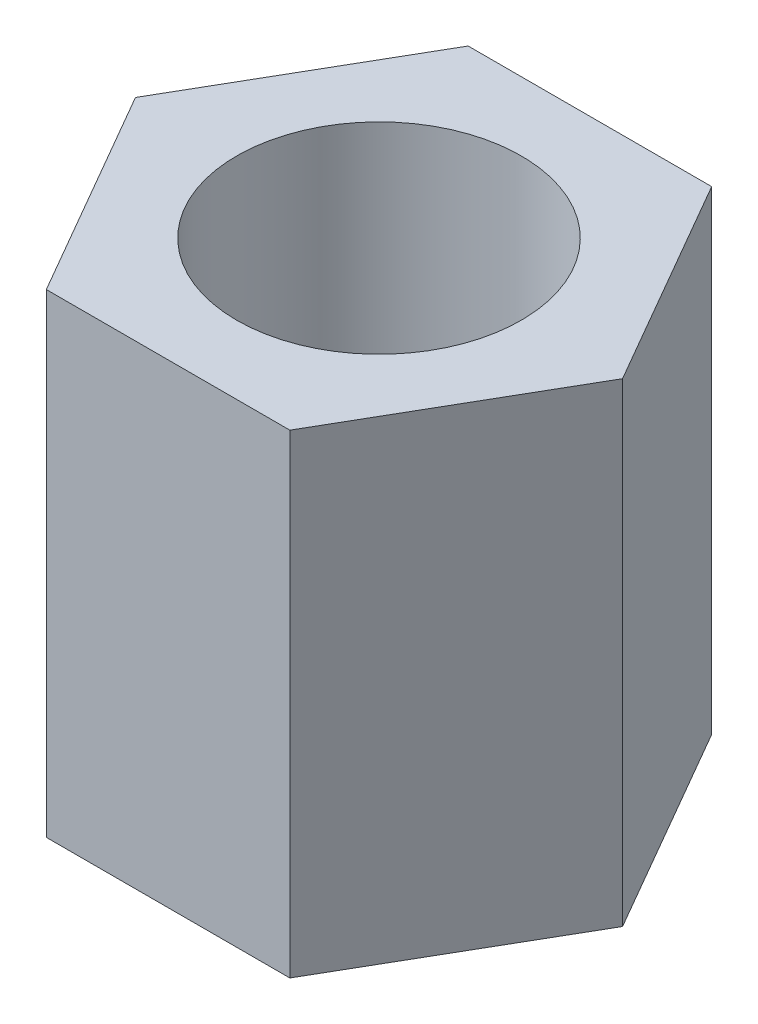
ISO-10303-21;
HEADER;
FILE_DESCRIPTION(('STEP AP214'),'2;1');
FILE_NAME('part.step','',(''),(''),'','','');
FILE_SCHEMA(('AUTOMOTIVE_DESIGN { 1 0 10303 214 1 1 1 1 }'));
ENDSEC;
DATA;
#1=APPLICATION_CONTEXT('core data for automotive mechanical design processes');
#2=APPLICATION_PROTOCOL_DEFINITION('international standard','automotive_design',2000,#1);
#3=PRODUCT_CONTEXT('',#1,'mechanical');
#4=PRODUCT('Part','Part','',(#3));
#5=PRODUCT_RELATED_PRODUCT_CATEGORY('part','',(#4));
#6=PRODUCT_DEFINITION_FORMATION('','',#4);
#7=PRODUCT_DEFINITION_CONTEXT('part definition',#1,'design');
#8=PRODUCT_DEFINITION('design','',#6,#7);
#9=PRODUCT_DEFINITION_SHAPE('','',#8);
#10=(LENGTH_UNIT() NAMED_UNIT(*) SI_UNIT(.MILLI.,.METRE.));
#11=(NAMED_UNIT(*) PLANE_ANGLE_UNIT() SI_UNIT($,.RADIAN.));
#12=(NAMED_UNIT(*) SI_UNIT($,.STERADIAN.) SOLID_ANGLE_UNIT());
#13=UNCERTAINTY_MEASURE_WITH_UNIT(LENGTH_MEASURE(1.E-05),#10,'distance_accuracy_value','');
#14=(GEOMETRIC_REPRESENTATION_CONTEXT(3) GLOBAL_UNCERTAINTY_ASSIGNED_CONTEXT((#13)) GLOBAL_UNIT_ASSIGNED_CONTEXT((#10,
#11,#12)) REPRESENTATION_CONTEXT('',''));
#15=CARTESIAN_POINT('',(0.,0.,0.));
#16=DIRECTION('',(0.,0.,1.));
#17=DIRECTION('',(1.,0.,0.));
#18=AXIS2_PLACEMENT_3D('',#15,#16,#17);
#19=CARTESIAN_POINT('',(0.,5.,0.));
#20=DIRECTION('',(0.,1.,0.));
#21=DIRECTION('',(0.,0.,1.));
#22=AXIS2_PLACEMENT_3D('',#19,#20,#21);
#23=PLANE('',#22);
#24=DIRECTION('',(0.499999999999995,0.,-0.866025403784442));
#25=VECTOR('',#24,1.);
#26=CARTESIAN_POINT('',(1.28323950277336,5.,2.22263601708282));
#27=LINE('',#26,#25);
#28=CARTESIAN_POINT('',(1.28323950277336,5.,2.22263601708282));
#29=VERTEX_POINT('',#28);
#30=CARTESIAN_POINT('',(2.56647900554667,5.,0.));
#31=VERTEX_POINT('',#30);
#32=EDGE_CURVE('E146',#29,#31,#27,.T.);
#33=ORIENTED_EDGE('',*,*,#32,.T.);
#34=DIRECTION('',(-0.500000000000001,0.,-0.866025403784438));
#35=VECTOR('',#34,1.);
#36=CARTESIAN_POINT('',(2.56647900554667,5.,0.));
#37=LINE('',#36,#35);
#38=CARTESIAN_POINT('',(1.28323950277333,5.,-2.22263601708284));
#39=VERTEX_POINT('',#38);
#40=EDGE_CURVE('E94',#31,#39,#37,.T.);
#41=ORIENTED_EDGE('',*,*,#40,.T.);
#42=DIRECTION('',(-1.,0.,0.));
#43=VECTOR('',#42,1.);
#44=CARTESIAN_POINT('',(1.28323950277333,5.,-2.22263601708284));
#45=LINE('',#44,#43);
#46=CARTESIAN_POINT('',(-1.28323950277334,5.,-2.22263601708283));
#47=VERTEX_POINT('',#46);
#48=EDGE_CURVE('E107',#39,#47,#45,.T.);
#49=ORIENTED_EDGE('',*,*,#48,.T.);
#50=DIRECTION('',(-0.499999999999995,0.,0.866025403784442));
#51=VECTOR('',#50,1.);
#52=CARTESIAN_POINT('',(-1.28323950277334,5.,-2.22263601708283));
#53=LINE('',#52,#51);
#54=CARTESIAN_POINT('',(-2.56647900554667,5.,0.));
#55=VERTEX_POINT('',#54);
#56=EDGE_CURVE('E101',#47,#55,#53,.T.);
#57=ORIENTED_EDGE('',*,*,#56,.T.);
#58=DIRECTION('',(0.500000000000007,0.,0.866025403784435));
#59=VECTOR('',#58,1.);
#60=CARTESIAN_POINT('',(-2.56647900554667,5.,0.));
#61=LINE('',#60,#59);
#62=CARTESIAN_POINT('',(-1.28323950277331,5.,2.22263601708285));
#63=VERTEX_POINT('',#62);
#64=EDGE_CURVE('E105',#55,#63,#61,.T.);
#65=ORIENTED_EDGE('',*,*,#64,.T.);
#66=DIRECTION('',(1.,0.,0.));
#67=VECTOR('',#66,1.);
#68=CARTESIAN_POINT('',(-1.28323950277331,5.,2.22263601708285));
#69=LINE('',#68,#67);
#70=EDGE_CURVE('E57',#63,#29,#69,.T.);
#71=ORIENTED_EDGE('',*,*,#70,.T.);
#72=EDGE_LOOP('',(#33,#41,#49,#57,#65,#71));
#73=FACE_BOUND('',#72,.T.);
#74=CARTESIAN_POINT('',(0.,5.,0.));
#75=DIRECTION('',(0.,1.,0.));
#76=DIRECTION('',(0.,0.,1.));
#77=AXIS2_PLACEMENT_3D('',#74,#75,#76);
#78=CIRCLE('',#77,1.5);
#79=CARTESIAN_POINT('',(0.,5.,1.5));
#80=VERTEX_POINT('',#79);
#81=EDGE_CURVE('E134',#80,#80,#78,.T.);
#82=ORIENTED_EDGE('',*,*,#81,.F.);
#83=EDGE_LOOP('',(#82));
#84=FACE_BOUND('',#83,.T.);
#85=ADVANCED_FACE('F39',(#73,#84),#23,.T.);
#86=CARTESIAN_POINT('',(0.,0.,0.));
#87=DIRECTION('',(0.,1.,0.));
#88=DIRECTION('',(0.,0.,1.));
#89=AXIS2_PLACEMENT_3D('',#86,#87,#88);
#90=PLANE('',#89);
#91=DIRECTION('',(0.499999999999995,0.,-0.866025403784442));
#92=VECTOR('',#91,1.);
#93=CARTESIAN_POINT('',(1.28323950277336,0.,2.22263601708282));
#94=LINE('',#93,#92);
#95=CARTESIAN_POINT('',(1.28323950277336,0.,2.22263601708282));
#96=VERTEX_POINT('',#95);
#97=CARTESIAN_POINT('',(2.56647900554667,0.,0.));
#98=VERTEX_POINT('',#97);
#99=EDGE_CURVE('E129',#96,#98,#94,.T.);
#100=ORIENTED_EDGE('',*,*,#99,.F.);
#101=DIRECTION('',(1.,0.,0.));
#102=VECTOR('',#101,1.);
#103=CARTESIAN_POINT('',(-1.28323950277331,0.,2.22263601708285));
#104=LINE('',#103,#102);
#105=CARTESIAN_POINT('',(-1.28323950277331,0.,2.22263601708285));
#106=VERTEX_POINT('',#105);
#107=EDGE_CURVE('E86',#106,#96,#104,.T.);
#108=ORIENTED_EDGE('',*,*,#107,.F.);
#109=DIRECTION('',(0.500000000000007,0.,0.866025403784435));
#110=VECTOR('',#109,1.);
#111=CARTESIAN_POINT('',(-2.56647900554667,0.,0.));
#112=LINE('',#111,#110);
#113=CARTESIAN_POINT('',(-2.56647900554667,0.,0.));
#114=VERTEX_POINT('',#113);
#115=EDGE_CURVE('E80',#114,#106,#112,.T.);
#116=ORIENTED_EDGE('',*,*,#115,.F.);
#117=DIRECTION('',(-0.499999999999995,0.,0.866025403784442));
#118=VECTOR('',#117,1.);
#119=CARTESIAN_POINT('',(-1.28323950277334,0.,-2.22263601708283));
#120=LINE('',#119,#118);
#121=CARTESIAN_POINT('',(-1.28323950277334,0.,-2.22263601708283));
#122=VERTEX_POINT('',#121);
#123=EDGE_CURVE('E116',#122,#114,#120,.T.);
#124=ORIENTED_EDGE('',*,*,#123,.F.);
#125=DIRECTION('',(-1.,0.,0.));
#126=VECTOR('',#125,1.);
#127=CARTESIAN_POINT('',(1.28323950277333,0.,-2.22263601708284));
#128=LINE('',#127,#126);
#129=CARTESIAN_POINT('',(1.28323950277333,0.,-2.22263601708284));
#130=VERTEX_POINT('',#129);
#131=EDGE_CURVE('E137',#130,#122,#128,.T.);
#132=ORIENTED_EDGE('',*,*,#131,.F.);
#133=DIRECTION('',(-0.500000000000001,0.,-0.866025403784438));
#134=VECTOR('',#133,1.);
#135=CARTESIAN_POINT('',(2.56647900554667,0.,0.));
#136=LINE('',#135,#134);
#137=EDGE_CURVE('E133',#98,#130,#136,.T.);
#138=ORIENTED_EDGE('',*,*,#137,.F.);
#139=EDGE_LOOP('',(#100,#108,#116,#124,#132,#138));
#140=FACE_BOUND('',#139,.T.);
#141=CARTESIAN_POINT('',(0.,0.,0.));
#142=DIRECTION('',(0.,1.,0.));
#143=DIRECTION('',(0.,0.,1.));
#144=AXIS2_PLACEMENT_3D('',#141,#142,#143);
#145=CIRCLE('',#144,1.5);
#146=CARTESIAN_POINT('',(0.,0.,1.5));
#147=VERTEX_POINT('',#146);
#148=EDGE_CURVE('E243',#147,#147,#145,.T.);
#149=ORIENTED_EDGE('',*,*,#148,.T.);
#150=EDGE_LOOP('',(#149));
#151=FACE_BOUND('',#150,.T.);
#152=ADVANCED_FACE('F159',(#140,#151),#90,.F.);
#153=CARTESIAN_POINT('',(1.28323950277336,5.,2.22263601708282));
#154=DIRECTION('',(-0.866025403784442,0.,-0.499999999999995));
#155=DIRECTION('',(-0.499999999999995,0.,0.866025403784442));
#156=AXIS2_PLACEMENT_3D('',#153,#154,#155);
#157=PLANE('',#156);
#158=ORIENTED_EDGE('',*,*,#99,.T.);
#159=DIRECTION('',(0.,-1.,0.));
#160=VECTOR('',#159,1.);
#161=CARTESIAN_POINT('',(2.56647900554667,5.,0.));
#162=LINE('',#161,#160);
#163=EDGE_CURVE('E11',#31,#98,#162,.T.);
#164=ORIENTED_EDGE('',*,*,#163,.F.);
#165=ORIENTED_EDGE('',*,*,#32,.F.);
#166=DIRECTION('',(0.,-1.,0.));
#167=VECTOR('',#166,1.);
#168=CARTESIAN_POINT('',(1.28323950277336,5.,2.22263601708282));
#169=LINE('',#168,#167);
#170=EDGE_CURVE('E125',#29,#96,#169,.T.);
#171=ORIENTED_EDGE('',*,*,#170,.T.);
#172=EDGE_LOOP('',(#158,#164,#165,#171));
#173=FACE_BOUND('',#172,.T.);
#174=ADVANCED_FACE('F41',(#173),#157,.F.);
#175=CARTESIAN_POINT('',(2.56647900554667,5.,0.));
#176=DIRECTION('',(-0.866025403784438,0.,0.500000000000001));
#177=DIRECTION('',(0.500000000000001,0.,0.866025403784438));
#178=AXIS2_PLACEMENT_3D('',#175,#176,#177);
#179=PLANE('',#178);
#180=ORIENTED_EDGE('',*,*,#137,.T.);
#181=DIRECTION('',(0.,-1.,0.));
#182=VECTOR('',#181,1.);
#183=CARTESIAN_POINT('',(1.28323950277333,5.,-2.22263601708284));
#184=LINE('',#183,#182);
#185=EDGE_CURVE('E49',#39,#130,#184,.T.);
#186=ORIENTED_EDGE('',*,*,#185,.F.);
#187=ORIENTED_EDGE('',*,*,#40,.F.);
#188=ORIENTED_EDGE('',*,*,#163,.T.);
#189=EDGE_LOOP('',(#180,#186,#187,#188));
#190=FACE_BOUND('',#189,.T.);
#191=ADVANCED_FACE('F184',(#190),#179,.F.);
#192=CARTESIAN_POINT('',(1.28323950277333,5.,-2.22263601708284));
#193=DIRECTION('',(0.,0.,1.));
#194=DIRECTION('',(1.,0.,0.));
#195=AXIS2_PLACEMENT_3D('',#192,#193,#194);
#196=PLANE('',#195);
#197=ORIENTED_EDGE('',*,*,#131,.T.);
#198=DIRECTION('',(0.,-1.,0.));
#199=VECTOR('',#198,1.);
#200=CARTESIAN_POINT('',(-1.28323950277334,5.,-2.22263601708283));
#201=LINE('',#200,#199);
#202=EDGE_CURVE('E118',#47,#122,#201,.T.);
#203=ORIENTED_EDGE('',*,*,#202,.F.);
#204=ORIENTED_EDGE('',*,*,#48,.F.);
#205=ORIENTED_EDGE('',*,*,#185,.T.);
#206=EDGE_LOOP('',(#197,#203,#204,#205));
#207=FACE_BOUND('',#206,.T.);
#208=ADVANCED_FACE('F156',(#207),#196,.F.);
#209=CARTESIAN_POINT('',(-1.28323950277334,5.,-2.22263601708283));
#210=DIRECTION('',(0.866025403784442,0.,0.499999999999995));
#211=DIRECTION('',(0.499999999999995,0.,-0.866025403784442));
#212=AXIS2_PLACEMENT_3D('',#209,#210,#211);
#213=PLANE('',#212);
#214=ORIENTED_EDGE('',*,*,#123,.T.);
#215=DIRECTION('',(0.,-1.,0.));
#216=VECTOR('',#215,1.);
#217=CARTESIAN_POINT('',(-2.56647900554667,5.,0.));
#218=LINE('',#217,#216);
#219=EDGE_CURVE('E113',#55,#114,#218,.T.);
#220=ORIENTED_EDGE('',*,*,#219,.F.);
#221=ORIENTED_EDGE('',*,*,#56,.F.);
#222=ORIENTED_EDGE('',*,*,#202,.T.);
#223=EDGE_LOOP('',(#214,#220,#221,#222));
#224=FACE_BOUND('',#223,.T.);
#225=ADVANCED_FACE('F114',(#224),#213,.F.);
#226=CARTESIAN_POINT('',(-2.56647900554667,5.,0.));
#227=DIRECTION('',(0.866025403784435,0.,-0.500000000000007));
#228=DIRECTION('',(-0.500000000000007,0.,-0.866025403784435));
#229=AXIS2_PLACEMENT_3D('',#226,#227,#228);
#230=PLANE('',#229);
#231=ORIENTED_EDGE('',*,*,#115,.T.);
#232=DIRECTION('',(0.,-1.,0.));
#233=VECTOR('',#232,1.);
#234=CARTESIAN_POINT('',(-1.28323950277331,5.,2.22263601708285));
#235=LINE('',#234,#233);
#236=EDGE_CURVE('E119',#63,#106,#235,.T.);
#237=ORIENTED_EDGE('',*,*,#236,.F.);
#238=ORIENTED_EDGE('',*,*,#64,.F.);
#239=ORIENTED_EDGE('',*,*,#219,.T.);
#240=EDGE_LOOP('',(#231,#237,#238,#239));
#241=FACE_BOUND('',#240,.T.);
#242=ADVANCED_FACE('F121',(#241),#230,.F.);
#243=CARTESIAN_POINT('',(-1.28323950277331,5.,2.22263601708285));
#244=DIRECTION('',(0.,0.,-1.));
#245=DIRECTION('',(-1.,0.,0.));
#246=AXIS2_PLACEMENT_3D('',#243,#244,#245);
#247=PLANE('',#246);
#248=ORIENTED_EDGE('',*,*,#107,.T.);
#249=ORIENTED_EDGE('',*,*,#170,.F.);
#250=ORIENTED_EDGE('',*,*,#70,.F.);
#251=ORIENTED_EDGE('',*,*,#236,.T.);
#252=EDGE_LOOP('',(#248,#249,#250,#251));
#253=FACE_BOUND('',#252,.T.);
#254=ADVANCED_FACE('F164',(#253),#247,.F.);
#255=CARTESIAN_POINT('',(0.,5.,0.));
#256=DIRECTION('',(0.,-1.,0.));
#257=DIRECTION('',(0.,0.,-1.));
#258=AXIS2_PLACEMENT_3D('',#255,#256,#257);
#259=CYLINDRICAL_SURFACE('',#258,1.5);
#260=ORIENTED_EDGE('',*,*,#81,.T.);
#261=EDGE_LOOP('',(#260));
#262=FACE_BOUND('',#261,.T.);
#263=ORIENTED_EDGE('',*,*,#148,.F.);
#264=EDGE_LOOP('',(#263));
#265=FACE_BOUND('',#264,.T.);
#266=ADVANCED_FACE('F166',(#262,#265),#259,.F.);
#267=CLOSED_SHELL('',(#85,#152,#174,#191,#208,#225,#242,#254,#266));
#268=MANIFOLD_SOLID_BREP('B2',#267);
#269=ADVANCED_BREP_SHAPE_REPRESENTATION('',(#18,#268),#14);
#270=SHAPE_DEFINITION_REPRESENTATION(#9,#269);
ENDSEC;
END-ISO-10303-21;
